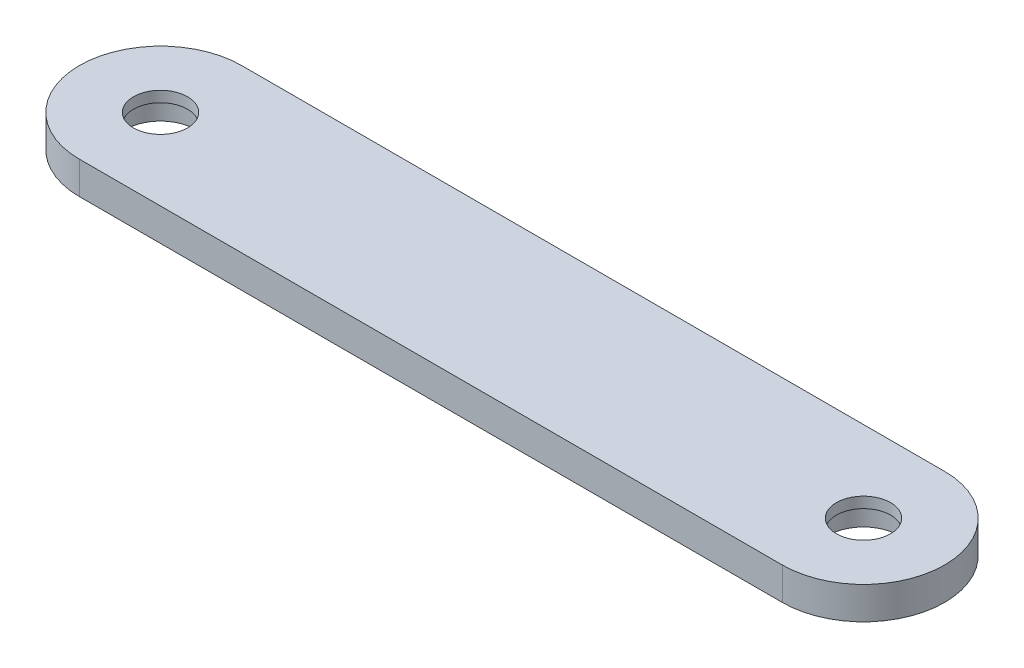
ISO-10303-21;
HEADER;
FILE_DESCRIPTION(('STEP AP214'),'2;1');
FILE_NAME('part.step','',(''),(''),'','','');
FILE_SCHEMA(('AUTOMOTIVE_DESIGN { 1 0 10303 214 1 1 1 1 }'));
ENDSEC;
DATA;
#1=APPLICATION_CONTEXT('core data for automotive mechanical design processes');
#2=APPLICATION_PROTOCOL_DEFINITION('international standard','automotive_design',2000,#1);
#3=PRODUCT_CONTEXT('',#1,'mechanical');
#4=PRODUCT('Part','Part','',(#3));
#5=PRODUCT_RELATED_PRODUCT_CATEGORY('part','',(#4));
#6=PRODUCT_DEFINITION_FORMATION('','',#4);
#7=PRODUCT_DEFINITION_CONTEXT('part definition',#1,'design');
#8=PRODUCT_DEFINITION('design','',#6,#7);
#9=PRODUCT_DEFINITION_SHAPE('','',#8);
#10=(LENGTH_UNIT() NAMED_UNIT(*) SI_UNIT(.MILLI.,.METRE.));
#11=(NAMED_UNIT(*) PLANE_ANGLE_UNIT() SI_UNIT($,.RADIAN.));
#12=(NAMED_UNIT(*) SI_UNIT($,.STERADIAN.) SOLID_ANGLE_UNIT());
#13=UNCERTAINTY_MEASURE_WITH_UNIT(LENGTH_MEASURE(1.E-05),#10,'distance_accuracy_value','');
#14=(GEOMETRIC_REPRESENTATION_CONTEXT(3) GLOBAL_UNCERTAINTY_ASSIGNED_CONTEXT((#13)) GLOBAL_UNIT_ASSIGNED_CONTEXT((#10,
#11,#12)) REPRESENTATION_CONTEXT('',''));
#15=CARTESIAN_POINT('',(0.,0.,0.));
#16=DIRECTION('',(0.,0.,1.));
#17=DIRECTION('',(1.,0.,0.));
#18=AXIS2_PLACEMENT_3D('',#15,#16,#17);
#19=CARTESIAN_POINT('',(-6.50000000000001,6.,-13.5));
#20=DIRECTION('',(0.,-1.,0.));
#21=DIRECTION('',(0.,0.,-1.));
#22=AXIS2_PLACEMENT_3D('',#19,#20,#21);
#23=CYLINDRICAL_SURFACE('',#22,5.);
#24=CARTESIAN_POINT('',(-6.50000000000001,6.,-13.5));
#25=DIRECTION('',(0.,1.,0.));
#26=DIRECTION('',(0.,0.,1.));
#27=AXIS2_PLACEMENT_3D('',#24,#25,#26);
#28=CIRCLE('',#27,5.);
#29=CARTESIAN_POINT('',(-6.50000000000001,6.,-8.5));
#30=VERTEX_POINT('',#29);
#31=EDGE_CURVE('E115',#30,#30,#28,.T.);
#32=ORIENTED_EDGE('',*,*,#31,.T.);
#33=EDGE_LOOP('',(#32));
#34=FACE_BOUND('',#33,.T.);
#35=CARTESIAN_POINT('',(-6.50000000000001,4.,-13.5));
#36=DIRECTION('',(0.,-1.,0.));
#37=DIRECTION('',(0.,0.,-1.));
#38=AXIS2_PLACEMENT_3D('',#35,#36,#37);
#39=CIRCLE('',#38,5.);
#40=CARTESIAN_POINT('',(-6.50000000000001,4.,-18.5));
#41=VERTEX_POINT('',#40);
#42=EDGE_CURVE('E42',#41,#41,#39,.T.);
#43=ORIENTED_EDGE('',*,*,#42,.T.);
#44=EDGE_LOOP('',(#43));
#45=FACE_BOUND('',#44,.T.);
#46=ADVANCED_FACE('F38',(#34,#45),#23,.F.);
#47=CARTESIAN_POINT('',(123.5,6.,-13.5000000000001));
#48=DIRECTION('',(0.,-1.,0.));
#49=DIRECTION('',(0.,0.,-1.));
#50=AXIS2_PLACEMENT_3D('',#47,#48,#49);
#51=CYLINDRICAL_SURFACE('',#50,5.);
#52=CARTESIAN_POINT('',(123.5,6.,-13.5000000000001));
#53=DIRECTION('',(0.,1.,0.));
#54=DIRECTION('',(0.,0.,1.));
#55=AXIS2_PLACEMENT_3D('',#52,#53,#54);
#56=CIRCLE('',#55,5.);
#57=CARTESIAN_POINT('',(123.5,6.,-8.50000000000008));
#58=VERTEX_POINT('',#57);
#59=EDGE_CURVE('E134',#58,#58,#56,.T.);
#60=ORIENTED_EDGE('',*,*,#59,.T.);
#61=EDGE_LOOP('',(#60));
#62=FACE_BOUND('',#61,.T.);
#63=CARTESIAN_POINT('',(123.5,4.,-13.5000000000001));
#64=DIRECTION('',(0.,-1.,0.));
#65=DIRECTION('',(0.,0.,-1.));
#66=AXIS2_PLACEMENT_3D('',#63,#64,#65);
#67=CIRCLE('',#66,5.);
#68=CARTESIAN_POINT('',(123.5,4.,-18.5000000000001));
#69=VERTEX_POINT('',#68);
#70=EDGE_CURVE('E125',#69,#69,#67,.T.);
#71=ORIENTED_EDGE('',*,*,#70,.T.);
#72=EDGE_LOOP('',(#71));
#73=FACE_BOUND('',#72,.T.);
#74=ADVANCED_FACE('F164',(#62,#73),#51,.F.);
#75=CARTESIAN_POINT('',(123.5,6.,-13.5000000000001));
#76=DIRECTION('',(0.,1.,0.));
#77=DIRECTION('',(0.,0.,1.));
#78=AXIS2_PLACEMENT_3D('',#75,#76,#77);
#79=PLANE('',#78);
#80=ORIENTED_EDGE('',*,*,#31,.F.);
#81=EDGE_LOOP('',(#80));
#82=FACE_BOUND('',#81,.T.);
#83=CARTESIAN_POINT('',(123.5,6.,-13.5000000000001));
#84=DIRECTION('',(0.,1.,0.));
#85=DIRECTION('',(0.,0.,1.));
#86=AXIS2_PLACEMENT_3D('',#83,#84,#85);
#87=CIRCLE('',#86,15.);
#88=CARTESIAN_POINT('',(123.5,6.,1.49999999999992));
#89=VERTEX_POINT('',#88);
#90=CARTESIAN_POINT('',(123.5,6.,-28.5000000000001));
#91=VERTEX_POINT('',#90);
#92=EDGE_CURVE('E94',#89,#91,#87,.T.);
#93=ORIENTED_EDGE('',*,*,#92,.T.);
#94=DIRECTION('',(-1.,0.,0.));
#95=VECTOR('',#94,1.);
#96=CARTESIAN_POINT('',(-6.50000000000001,6.,-28.5));
#97=LINE('',#96,#95);
#98=CARTESIAN_POINT('',(-6.50000000000001,6.,-28.5));
#99=VERTEX_POINT('',#98);
#100=EDGE_CURVE('E88',#91,#99,#97,.T.);
#101=ORIENTED_EDGE('',*,*,#100,.T.);
#102=CARTESIAN_POINT('',(-6.50000000000001,6.,-13.5));
#103=DIRECTION('',(0.,1.,0.));
#104=DIRECTION('',(0.,0.,1.));
#105=AXIS2_PLACEMENT_3D('',#102,#103,#104);
#106=CIRCLE('',#105,15.);
#107=CARTESIAN_POINT('',(-6.5,6.,1.5));
#108=VERTEX_POINT('',#107);
#109=EDGE_CURVE('E92',#99,#108,#106,.T.);
#110=ORIENTED_EDGE('',*,*,#109,.T.);
#111=DIRECTION('',(1.,0.,0.));
#112=VECTOR('',#111,1.);
#113=CARTESIAN_POINT('',(-6.5,6.,1.5));
#114=LINE('',#113,#112);
#115=EDGE_CURVE('E58',#108,#89,#114,.T.);
#116=ORIENTED_EDGE('',*,*,#115,.T.);
#117=EDGE_LOOP('',(#93,#101,#110,#116));
#118=FACE_BOUND('',#117,.T.);
#119=ORIENTED_EDGE('',*,*,#59,.F.);
#120=EDGE_LOOP('',(#119));
#121=FACE_BOUND('',#120,.T.);
#122=ADVANCED_FACE('F89',(#82,#118,#121),#79,.T.);
#123=CARTESIAN_POINT('',(123.5,0.,-13.5000000000001));
#124=DIRECTION('',(0.,1.,0.));
#125=DIRECTION('',(0.,0.,1.));
#126=AXIS2_PLACEMENT_3D('',#123,#124,#125);
#127=PLANE('',#126);
#128=CARTESIAN_POINT('',(123.5,0.,-13.5000000000001));
#129=DIRECTION('',(0.,-1.,0.));
#130=DIRECTION('',(0.,0.,-1.));
#131=AXIS2_PLACEMENT_3D('',#128,#129,#130);
#132=CIRCLE('',#131,6.5);
#133=CARTESIAN_POINT('',(123.5,0.,-20.0000000000001));
#134=VERTEX_POINT('',#133);
#135=EDGE_CURVE('E136',#134,#134,#132,.T.);
#136=ORIENTED_EDGE('',*,*,#135,.F.);
#137=EDGE_LOOP('',(#136));
#138=FACE_BOUND('',#137,.T.);
#139=CARTESIAN_POINT('',(-6.50000000000001,0.,-13.5));
#140=DIRECTION('',(0.,-1.,0.));
#141=DIRECTION('',(0.,0.,-1.));
#142=AXIS2_PLACEMENT_3D('',#139,#140,#141);
#143=CIRCLE('',#142,6.5);
#144=CARTESIAN_POINT('',(-6.50000000000001,0.,-20.));
#145=VERTEX_POINT('',#144);
#146=EDGE_CURVE('E148',#145,#145,#143,.T.);
#147=ORIENTED_EDGE('',*,*,#146,.F.);
#148=EDGE_LOOP('',(#147));
#149=FACE_BOUND('',#148,.T.);
#150=CARTESIAN_POINT('',(123.5,0.,-13.5000000000001));
#151=DIRECTION('',(0.,1.,0.));
#152=DIRECTION('',(0.,0.,1.));
#153=AXIS2_PLACEMENT_3D('',#150,#151,#152);
#154=CIRCLE('',#153,15.);
#155=CARTESIAN_POINT('',(123.5,0.,1.49999999999992));
#156=VERTEX_POINT('',#155);
#157=CARTESIAN_POINT('',(123.5,0.,-28.5000000000001));
#158=VERTEX_POINT('',#157);
#159=EDGE_CURVE('E111',#156,#158,#154,.T.);
#160=ORIENTED_EDGE('',*,*,#159,.F.);
#161=DIRECTION('',(1.,0.,0.));
#162=VECTOR('',#161,1.);
#163=CARTESIAN_POINT('',(-6.5,0.,1.5));
#164=LINE('',#163,#162);
#165=CARTESIAN_POINT('',(-6.5,0.,1.5));
#166=VERTEX_POINT('',#165);
#167=EDGE_CURVE('E81',#166,#156,#164,.T.);
#168=ORIENTED_EDGE('',*,*,#167,.F.);
#169=CARTESIAN_POINT('',(-6.50000000000001,0.,-13.5));
#170=DIRECTION('',(0.,1.,0.));
#171=DIRECTION('',(0.,0.,1.));
#172=AXIS2_PLACEMENT_3D('',#169,#170,#171);
#173=CIRCLE('',#172,15.);
#174=CARTESIAN_POINT('',(-6.50000000000001,0.,-28.5));
#175=VERTEX_POINT('',#174);
#176=EDGE_CURVE('E75',#175,#166,#173,.T.);
#177=ORIENTED_EDGE('',*,*,#176,.F.);
#178=DIRECTION('',(-1.,0.,0.));
#179=VECTOR('',#178,1.);
#180=CARTESIAN_POINT('',(-6.50000000000001,0.,-28.5));
#181=LINE('',#180,#179);
#182=EDGE_CURVE('E99',#158,#175,#181,.T.);
#183=ORIENTED_EDGE('',*,*,#182,.F.);
#184=EDGE_LOOP('',(#160,#168,#177,#183));
#185=FACE_BOUND('',#184,.T.);
#186=ADVANCED_FACE('F163',(#138,#149,#185),#127,.F.);
#187=CARTESIAN_POINT('',(123.5,6.,-13.5000000000001));
#188=DIRECTION('',(0.,-1.,0.));
#189=DIRECTION('',(0.,0.,-1.));
#190=AXIS2_PLACEMENT_3D('',#187,#188,#189);
#191=CYLINDRICAL_SURFACE('',#190,15.);
#192=ORIENTED_EDGE('',*,*,#159,.T.);
#193=DIRECTION('',(0.,-1.,0.));
#194=VECTOR('',#193,1.);
#195=CARTESIAN_POINT('',(123.5,6.,-28.5000000000001));
#196=LINE('',#195,#194);
#197=EDGE_CURVE('E11',#91,#158,#196,.T.);
#198=ORIENTED_EDGE('',*,*,#197,.F.);
#199=ORIENTED_EDGE('',*,*,#92,.F.);
#200=DIRECTION('',(0.,-1.,0.));
#201=VECTOR('',#200,1.);
#202=CARTESIAN_POINT('',(123.5,6.,1.49999999999992));
#203=LINE('',#202,#201);
#204=EDGE_CURVE('E107',#89,#156,#203,.T.);
#205=ORIENTED_EDGE('',*,*,#204,.T.);
#206=EDGE_LOOP('',(#192,#198,#199,#205));
#207=FACE_BOUND('',#206,.T.);
#208=ADVANCED_FACE('F40',(#207),#191,.T.);
#209=CARTESIAN_POINT('',(-6.50000000000001,6.,-28.5));
#210=DIRECTION('',(0.,0.,1.));
#211=DIRECTION('',(1.,0.,0.));
#212=AXIS2_PLACEMENT_3D('',#209,#210,#211);
#213=PLANE('',#212);
#214=ORIENTED_EDGE('',*,*,#182,.T.);
#215=DIRECTION('',(0.,-1.,0.));
#216=VECTOR('',#215,1.);
#217=CARTESIAN_POINT('',(-6.50000000000001,6.,-28.5));
#218=LINE('',#217,#216);
#219=EDGE_CURVE('E49',#99,#175,#218,.T.);
#220=ORIENTED_EDGE('',*,*,#219,.F.);
#221=ORIENTED_EDGE('',*,*,#100,.F.);
#222=ORIENTED_EDGE('',*,*,#197,.T.);
#223=EDGE_LOOP('',(#214,#220,#221,#222));
#224=FACE_BOUND('',#223,.T.);
#225=ADVANCED_FACE('F98',(#224),#213,.F.);
#226=CARTESIAN_POINT('',(-6.50000000000001,6.,-13.5));
#227=DIRECTION('',(0.,-1.,0.));
#228=DIRECTION('',(0.,0.,-1.));
#229=AXIS2_PLACEMENT_3D('',#226,#227,#228);
#230=CYLINDRICAL_SURFACE('',#229,15.);
#231=ORIENTED_EDGE('',*,*,#176,.T.);
#232=DIRECTION('',(0.,-1.,0.));
#233=VECTOR('',#232,1.);
#234=CARTESIAN_POINT('',(-6.5,6.,1.5));
#235=LINE('',#234,#233);
#236=EDGE_CURVE('E101',#108,#166,#235,.T.);
#237=ORIENTED_EDGE('',*,*,#236,.F.);
#238=ORIENTED_EDGE('',*,*,#109,.F.);
#239=ORIENTED_EDGE('',*,*,#219,.T.);
#240=EDGE_LOOP('',(#231,#237,#238,#239));
#241=FACE_BOUND('',#240,.T.);
#242=ADVANCED_FACE('F103',(#241),#230,.T.);
#243=CARTESIAN_POINT('',(-6.5,6.,1.5));
#244=DIRECTION('',(0.,0.,-1.));
#245=DIRECTION('',(-1.,0.,0.));
#246=AXIS2_PLACEMENT_3D('',#243,#244,#245);
#247=PLANE('',#246);
#248=ORIENTED_EDGE('',*,*,#167,.T.);
#249=ORIENTED_EDGE('',*,*,#204,.F.);
#250=ORIENTED_EDGE('',*,*,#115,.F.);
#251=ORIENTED_EDGE('',*,*,#236,.T.);
#252=EDGE_LOOP('',(#248,#249,#250,#251));
#253=FACE_BOUND('',#252,.T.);
#254=ADVANCED_FACE('F193',(#253),#247,.F.);
#255=CARTESIAN_POINT('',(123.5,4.,-13.5000000000001));
#256=DIRECTION('',(0.,-1.,0.));
#257=DIRECTION('',(0.,0.,-1.));
#258=AXIS2_PLACEMENT_3D('',#255,#256,#257);
#259=CYLINDRICAL_SURFACE('',#258,6.5);
#260=CARTESIAN_POINT('',(123.5,4.,-13.5000000000001));
#261=DIRECTION('',(0.,-1.,0.));
#262=DIRECTION('',(0.,0.,-1.));
#263=AXIS2_PLACEMENT_3D('',#260,#261,#262);
#264=CIRCLE('',#263,6.5);
#265=CARTESIAN_POINT('',(123.5,4.,-20.0000000000001));
#266=VERTEX_POINT('',#265);
#267=EDGE_CURVE('E128',#266,#266,#264,.T.);
#268=ORIENTED_EDGE('',*,*,#267,.F.);
#269=EDGE_LOOP('',(#268));
#270=FACE_BOUND('',#269,.T.);
#271=ORIENTED_EDGE('',*,*,#135,.T.);
#272=EDGE_LOOP('',(#271));
#273=FACE_BOUND('',#272,.T.);
#274=ADVANCED_FACE('F190',(#270,#273),#259,.F.);
#275=CARTESIAN_POINT('',(123.5,4.,-13.5000000000001));
#276=DIRECTION('',(0.,-1.,0.));
#277=DIRECTION('',(0.,0.,-1.));
#278=AXIS2_PLACEMENT_3D('',#275,#276,#277);
#279=PLANE('',#278);
#280=ORIENTED_EDGE('',*,*,#70,.F.);
#281=EDGE_LOOP('',(#280));
#282=FACE_BOUND('',#281,.T.);
#283=ORIENTED_EDGE('',*,*,#267,.T.);
#284=EDGE_LOOP('',(#283));
#285=FACE_BOUND('',#284,.T.);
#286=ADVANCED_FACE('F185',(#282,#285),#279,.T.);
#287=CARTESIAN_POINT('',(-6.50000000000001,4.,-13.5));
#288=DIRECTION('',(0.,-1.,0.));
#289=DIRECTION('',(0.,0.,-1.));
#290=AXIS2_PLACEMENT_3D('',#287,#288,#289);
#291=CYLINDRICAL_SURFACE('',#290,6.5);
#292=CARTESIAN_POINT('',(-6.50000000000001,4.,-13.5));
#293=DIRECTION('',(0.,-1.,0.));
#294=DIRECTION('',(0.,0.,-1.));
#295=AXIS2_PLACEMENT_3D('',#292,#293,#294);
#296=CIRCLE('',#295,6.5);
#297=CARTESIAN_POINT('',(-6.50000000000001,4.,-20.));
#298=VERTEX_POINT('',#297);
#299=EDGE_CURVE('E142',#298,#298,#296,.T.);
#300=ORIENTED_EDGE('',*,*,#299,.F.);
#301=EDGE_LOOP('',(#300));
#302=FACE_BOUND('',#301,.T.);
#303=ORIENTED_EDGE('',*,*,#146,.T.);
#304=EDGE_LOOP('',(#303));
#305=FACE_BOUND('',#304,.T.);
#306=ADVANCED_FACE('F181',(#302,#305),#291,.F.);
#307=CARTESIAN_POINT('',(-6.50000000000001,4.,-13.5));
#308=DIRECTION('',(0.,-1.,0.));
#309=DIRECTION('',(0.,0.,-1.));
#310=AXIS2_PLACEMENT_3D('',#307,#308,#309);
#311=PLANE('',#310);
#312=ORIENTED_EDGE('',*,*,#42,.F.);
#313=EDGE_LOOP('',(#312));
#314=FACE_BOUND('',#313,.T.);
#315=ORIENTED_EDGE('',*,*,#299,.T.);
#316=EDGE_LOOP('',(#315));
#317=FACE_BOUND('',#316,.T.);
#318=ADVANCED_FACE('F184',(#314,#317),#311,.T.);
#319=CLOSED_SHELL('',(#46,#74,#122,#186,#208,#225,#242,#254,#274,#286,#306,#318));
#320=MANIFOLD_SOLID_BREP('B2',#319);
#321=ADVANCED_BREP_SHAPE_REPRESENTATION('',(#18,#320),#14);
#322=SHAPE_DEFINITION_REPRESENTATION(#9,#321);
ENDSEC;
END-ISO-10303-21;
